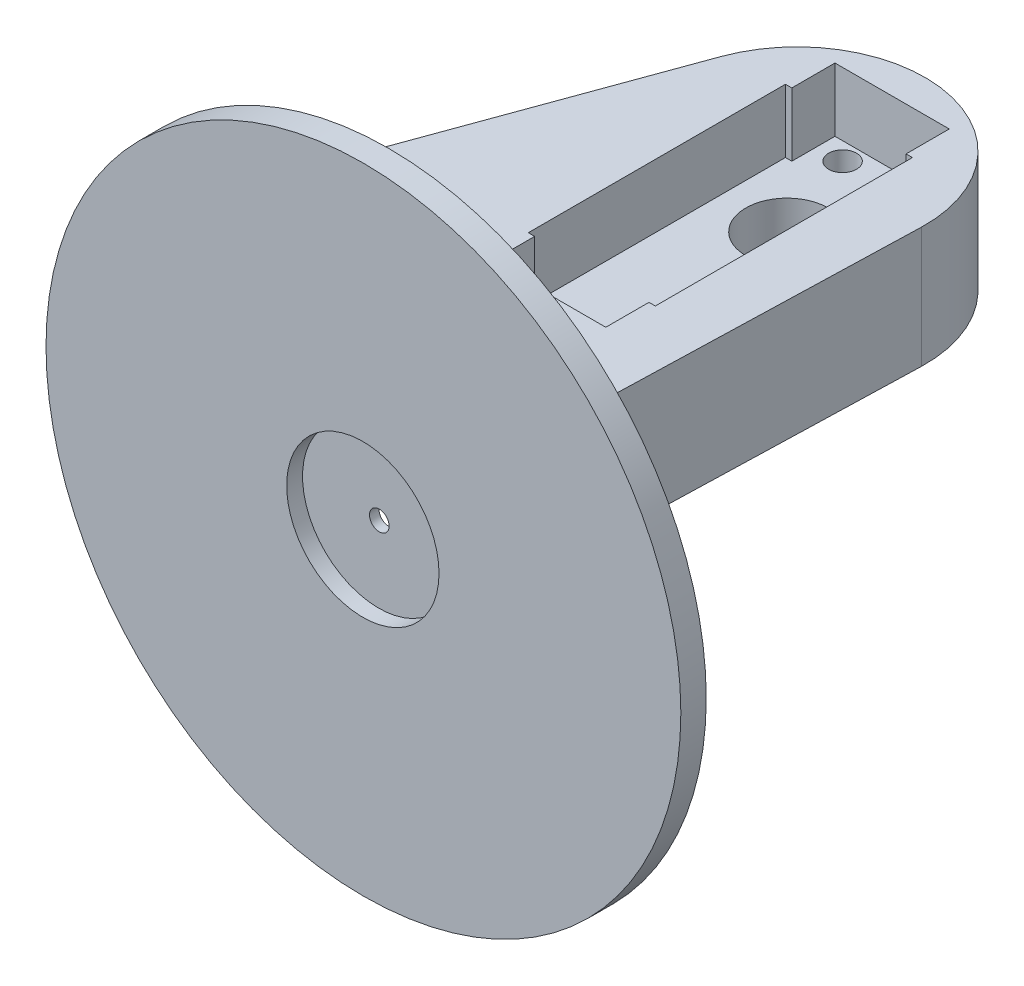
ISO-10303-21;
HEADER;
FILE_DESCRIPTION(('STEP AP214'),'2;1');
FILE_NAME('part.step','',(''),(''),'','','');
FILE_SCHEMA(('AUTOMOTIVE_DESIGN { 1 0 10303 214 1 1 1 1 }'));
ENDSEC;
DATA;
#1=APPLICATION_CONTEXT('core data for automotive mechanical design processes');
#2=APPLICATION_PROTOCOL_DEFINITION('international standard','automotive_design',2000,#1);
#3=PRODUCT_CONTEXT('',#1,'mechanical');
#4=PRODUCT('Part','Part','',(#3));
#5=PRODUCT_RELATED_PRODUCT_CATEGORY('part','',(#4));
#6=PRODUCT_DEFINITION_FORMATION('','',#4);
#7=PRODUCT_DEFINITION_CONTEXT('part definition',#1,'design');
#8=PRODUCT_DEFINITION('design','',#6,#7);
#9=PRODUCT_DEFINITION_SHAPE('','',#8);
#10=(LENGTH_UNIT() NAMED_UNIT(*) SI_UNIT(.MILLI.,.METRE.));
#11=(NAMED_UNIT(*) PLANE_ANGLE_UNIT() SI_UNIT($,.RADIAN.));
#12=(NAMED_UNIT(*) SI_UNIT($,.STERADIAN.) SOLID_ANGLE_UNIT());
#13=UNCERTAINTY_MEASURE_WITH_UNIT(LENGTH_MEASURE(1.E-05),#10,'distance_accuracy_value','');
#14=(GEOMETRIC_REPRESENTATION_CONTEXT(3) GLOBAL_UNCERTAINTY_ASSIGNED_CONTEXT((#13)) GLOBAL_UNIT_ASSIGNED_CONTEXT((#10,
#11,#12)) REPRESENTATION_CONTEXT('',''));
#15=CARTESIAN_POINT('',(0.,0.,0.));
#16=DIRECTION('',(0.,0.,1.));
#17=DIRECTION('',(1.,0.,0.));
#18=AXIS2_PLACEMENT_3D('',#15,#16,#17);
#19=CARTESIAN_POINT('',(-32.5425054731123,-36.3294906621392,35.2443237019626));
#20=DIRECTION('',(-0.717405595132056,0.,0.696655734257044));
#21=DIRECTION('',(0.,-1.,0.));
#22=AXIS2_PLACEMENT_3D('',#19,#20,#21);
#23=PLANE('',#22);
#24=DIRECTION('',(0.,-1.,0.));
#25=VECTOR('',#24,1.);
#26=CARTESIAN_POINT('',(-32.5425054731123,-36.3294906621392,35.2443237019626));
#27=LINE('',#26,#25);
#28=CARTESIAN_POINT('',(-32.5425054731123,-26.3294906621392,35.2443237019626));
#29=VERTEX_POINT('',#28);
#30=CARTESIAN_POINT('',(-32.5425054731123,-45.3294906621392,35.2443237019626));
#31=VERTEX_POINT('',#30);
#32=EDGE_CURVE('E398',#29,#31,#27,.T.);
#33=ORIENTED_EDGE('',*,*,#32,.F.);
#34=DIRECTION('',(-0.696655734257044,0.,-0.717405595132056));
#35=VECTOR('',#34,1.);
#36=CARTESIAN_POINT('',(-65.2809700757292,-26.3294906621392,1.53074534895049));
#37=LINE('',#36,#35);
#38=CARTESIAN_POINT('',(-25.0457346485598,-26.3294906621392,42.9643855208643));
#39=VERTEX_POINT('',#38);
#40=EDGE_CURVE('E161',#29,#39,#37,.F.);
#41=ORIENTED_EDGE('',*,*,#40,.T.);
#42=DIRECTION('',(0.,1.,0.));
#43=VECTOR('',#42,1.);
#44=CARTESIAN_POINT('',(-25.0457346485598,-53.1105605464471,42.9643855208643));
#45=LINE('',#44,#43);
#46=CARTESIAN_POINT('',(-25.0457346485598,-45.3294906621392,42.9643855208643));
#47=VERTEX_POINT('',#46);
#48=EDGE_CURVE('E401',#47,#39,#45,.T.);
#49=ORIENTED_EDGE('',*,*,#48,.F.);
#50=DIRECTION('',(0.696655734257044,0.,0.717405595132056));
#51=VECTOR('',#50,1.);
#52=CARTESIAN_POINT('',(-32.5425054731123,-45.3294906621392,35.2443237019626));
#53=LINE('',#52,#51);
#54=EDGE_CURVE('E13',#47,#31,#53,.F.);
#55=ORIENTED_EDGE('',*,*,#54,.T.);
#56=EDGE_LOOP('',(#33,#41,#49,#55));
#57=FACE_BOUND('',#56,.T.);
#58=ADVANCED_FACE('F153',(#57),#23,.F.);
#59=CARTESIAN_POINT('',(-41.3715056742024,-36.3294906621392,-20.2512811920762));
#60=DIRECTION('',(0.,0.,-1.));
#61=DIRECTION('',(-1.,0.,0.));
#62=AXIS2_PLACEMENT_3D('',#59,#60,#61);
#63=PLANE('',#62);
#64=DIRECTION('',(0.,1.,0.));
#65=VECTOR('',#64,1.);
#66=CARTESIAN_POINT('',(-42.3715056742024,-36.3294906621392,-20.2512811920762));
#67=LINE('',#66,#65);
#68=CARTESIAN_POINT('',(-42.3715056742024,-36.3294906621392,-20.2512811920762));
#69=VERTEX_POINT('',#68);
#70=CARTESIAN_POINT('',(-42.3715056742025,-26.3294906621392,-20.2512811920762));
#71=VERTEX_POINT('',#70);
#72=EDGE_CURVE('E282',#69,#71,#67,.T.);
#73=ORIENTED_EDGE('',*,*,#72,.F.);
#74=DIRECTION('',(-1.,0.,0.));
#75=VECTOR('',#74,1.);
#76=CARTESIAN_POINT('',(-41.3715056742024,-36.3294906621392,-20.2512811920762));
#77=LINE('',#76,#75);
#78=CARTESIAN_POINT('',(-41.3715056742024,-36.3294906621392,-20.2512811920762));
#79=VERTEX_POINT('',#78);
#80=EDGE_CURVE('E350',#79,#69,#77,.T.);
#81=ORIENTED_EDGE('',*,*,#80,.F.);
#82=DIRECTION('',(0.,1.,0.));
#83=VECTOR('',#82,1.);
#84=CARTESIAN_POINT('',(-41.3715056742024,-36.3294906621392,-20.2512811920762));
#85=LINE('',#84,#83);
#86=CARTESIAN_POINT('',(-41.3715056742024,-26.3294906621392,-20.2512811920762));
#87=VERTEX_POINT('',#86);
#88=EDGE_CURVE('E376',#79,#87,#85,.T.);
#89=ORIENTED_EDGE('',*,*,#88,.T.);
#90=DIRECTION('',(-1.,0.,0.));
#91=VECTOR('',#90,1.);
#92=CARTESIAN_POINT('',(-41.3715056742024,-26.3294906621392,-20.2512811920762));
#93=LINE('',#92,#91);
#94=EDGE_CURVE('E363',#87,#71,#93,.T.);
#95=ORIENTED_EDGE('',*,*,#94,.T.);
#96=EDGE_LOOP('',(#73,#81,#89,#95));
#97=FACE_BOUND('',#96,.T.);
#98=ADVANCED_FACE('F421',(#97),#63,.F.);
#99=CARTESIAN_POINT('',(-41.3715056742024,-36.3294906621392,20.2500000000002));
#100=DIRECTION('',(0.,0.,-1.));
#101=DIRECTION('',(-1.,0.,0.));
#102=AXIS2_PLACEMENT_3D('',#99,#100,#101);
#103=PLANE('',#102);
#104=DIRECTION('',(-1.,0.,0.));
#105=VECTOR('',#104,1.);
#106=CARTESIAN_POINT('',(-41.3715056742024,-26.3294906621392,20.2500000000002));
#107=LINE('',#106,#105);
#108=CARTESIAN_POINT('',(-60.3715056742024,-26.3294906621392,20.2500000000002));
#109=VERTEX_POINT('',#108);
#110=CARTESIAN_POINT('',(-61.3752997116946,-26.3294906621392,20.2500000000002));
#111=VERTEX_POINT('',#110);
#112=EDGE_CURVE('E369',#109,#111,#107,.T.);
#113=ORIENTED_EDGE('',*,*,#112,.F.);
#114=DIRECTION('',(0.,1.,0.));
#115=VECTOR('',#114,1.);
#116=CARTESIAN_POINT('',(-60.3715056742024,-36.3294906621392,20.2500000000002));
#117=LINE('',#116,#115);
#118=CARTESIAN_POINT('',(-60.3715056742024,-36.3294906621392,20.2500000000002));
#119=VERTEX_POINT('',#118);
#120=EDGE_CURVE('E334',#119,#109,#117,.T.);
#121=ORIENTED_EDGE('',*,*,#120,.F.);
#122=DIRECTION('',(-1.,0.,0.));
#123=VECTOR('',#122,1.);
#124=CARTESIAN_POINT('',(-41.3715056742024,-36.3294906621392,20.2500000000002));
#125=LINE('',#124,#123);
#126=CARTESIAN_POINT('',(-61.3752997116946,-36.3294906621392,20.2500000000002));
#127=VERTEX_POINT('',#126);
#128=EDGE_CURVE('E356',#119,#127,#125,.T.);
#129=ORIENTED_EDGE('',*,*,#128,.T.);
#130=DIRECTION('',(0.,1.,0.));
#131=VECTOR('',#130,1.);
#132=CARTESIAN_POINT('',(-61.3752997116946,-36.3294906621392,20.2500000000002));
#133=LINE('',#132,#131);
#134=EDGE_CURVE('E380',#127,#111,#133,.T.);
#135=ORIENTED_EDGE('',*,*,#134,.T.);
#136=EDGE_LOOP('',(#113,#121,#129,#135));
#137=FACE_BOUND('',#136,.T.);
#138=ADVANCED_FACE('F426',(#137),#103,.T.);
#139=CARTESIAN_POINT('',(-92.7691218237599,-36.3294906621392,42.9643855208643));
#140=DIRECTION('',(0.939692620785907,0.,0.342020143325673));
#141=DIRECTION('',(0.342020143325673,0.,-0.939692620785907));
#142=AXIS2_PLACEMENT_3D('',#139,#140,#141);
#143=PLANE('',#142);
#144=DIRECTION('',(0.342020143325673,0.,-0.939692620785907));
#145=VECTOR('',#144,1.);
#146=CARTESIAN_POINT('',(-92.7691218237599,-26.3294906621392,42.9643855208643));
#147=LINE('',#146,#145);
#148=CARTESIAN_POINT('',(-92.7691218237599,-26.3294906621392,42.9643855208643));
#149=VERTEX_POINT('',#148);
#150=CARTESIAN_POINT('',(-70.2427293849113,-26.3294906621392,-18.9263690466445));
#151=VERTEX_POINT('',#150);
#152=EDGE_CURVE('E279',#149,#151,#147,.T.);
#153=ORIENTED_EDGE('',*,*,#152,.T.);
#154=DIRECTION('',(0.,1.,0.));
#155=VECTOR('',#154,1.);
#156=CARTESIAN_POINT('',(-70.2427293849113,-36.3294906621392,-18.9263690466445));
#157=LINE('',#156,#155);
#158=CARTESIAN_POINT('',(-70.2427293849113,-45.3294906621392,-18.9263690466445));
#159=VERTEX_POINT('',#158);
#160=EDGE_CURVE('E274',#159,#151,#157,.T.);
#161=ORIENTED_EDGE('',*,*,#160,.F.);
#162=DIRECTION('',(0.342020143325673,0.,-0.939692620785907));
#163=VECTOR('',#162,1.);
#164=CARTESIAN_POINT('',(-92.7691218237599,-45.3294906621392,42.9643855208643));
#165=LINE('',#164,#163);
#166=CARTESIAN_POINT('',(-92.7691218237599,-45.3294906621392,42.9643855208643));
#167=VERTEX_POINT('',#166);
#168=EDGE_CURVE('E278',#167,#159,#165,.T.);
#169=ORIENTED_EDGE('',*,*,#168,.F.);
#170=DIRECTION('',(0.,1.,0.));
#171=VECTOR('',#170,1.);
#172=CARTESIAN_POINT('',(-92.7691218237599,-36.3294906621392,42.9643855208643));
#173=LINE('',#172,#171);
#174=EDGE_CURVE('E391',#167,#149,#173,.T.);
#175=ORIENTED_EDGE('',*,*,#174,.T.);
#176=EDGE_LOOP('',(#153,#161,#169,#175));
#177=FACE_BOUND('',#176,.T.);
#178=ADVANCED_FACE('F276',(#177),#143,.F.);
#179=CARTESIAN_POINT('',(-51.3105368076772,-36.3294906621392,-12.0356144791357));
#180=DIRECTION('',(0.,1.,0.));
#181=DIRECTION('',(-1.,0.,0.));
#182=AXIS2_PLACEMENT_3D('',#179,#180,#181);
#183=CYLINDRICAL_SURFACE('',#182,20.147218524926);
#184=CARTESIAN_POINT('',(-51.3105368076772,-26.3294906621392,-12.0356144791357));
#185=DIRECTION('',(0.,-1.,0.));
#186=DIRECTION('',(1.,0.,0.));
#187=AXIS2_PLACEMENT_3D('',#184,#185,#186);
#188=CIRCLE('',#187,20.147218524926);
#189=CARTESIAN_POINT('',(-31.1719928032039,-26.3294906621392,-11.4444633385483));
#190=VERTEX_POINT('',#189);
#191=EDGE_CURVE('E386',#151,#190,#188,.T.);
#192=ORIENTED_EDGE('',*,*,#191,.T.);
#193=DIRECTION('',(0.,1.,0.));
#194=VECTOR('',#193,1.);
#195=CARTESIAN_POINT('',(-31.1719928032039,-36.3294906621392,-11.4444633385483));
#196=LINE('',#195,#194);
#197=CARTESIAN_POINT('',(-31.1719928032039,-45.3294906621392,-11.4444633385483));
#198=VERTEX_POINT('',#197);
#199=EDGE_CURVE('E283',#198,#190,#196,.T.);
#200=ORIENTED_EDGE('',*,*,#199,.F.);
#201=CARTESIAN_POINT('',(-51.3105368076772,-45.3294906621392,-12.0356144791357));
#202=DIRECTION('',(0.,-1.,0.));
#203=DIRECTION('',(1.,0.,0.));
#204=AXIS2_PLACEMENT_3D('',#201,#202,#203);
#205=CIRCLE('',#204,20.147218524926);
#206=EDGE_CURVE('E286',#159,#198,#205,.T.);
#207=ORIENTED_EDGE('',*,*,#206,.F.);
#208=ORIENTED_EDGE('',*,*,#160,.T.);
#209=EDGE_LOOP('',(#192,#200,#207,#208));
#210=FACE_BOUND('',#209,.T.);
#211=ADVANCED_FACE('F287',(#210),#183,.T.);
#212=CARTESIAN_POINT('',(-32.7691218237599,-36.3294906621392,42.9643855208643));
#213=DIRECTION('',(0.999569443273668,0.,0.0293415758535591));
#214=DIRECTION('',(0.0293415758535591,0.,-0.999569443273668));
#215=AXIS2_PLACEMENT_3D('',#212,#213,#214);
#216=PLANE('',#215);
#217=DIRECTION('',(0.029341575853559,0.,-0.999569443273668));
#218=VECTOR('',#217,1.);
#219=CARTESIAN_POINT('',(-32.7691218237599,-26.3294906621392,42.9643855208643));
#220=LINE('',#219,#218);
#221=EDGE_CURVE('E388',#29,#190,#220,.T.);
#222=ORIENTED_EDGE('',*,*,#221,.F.);
#223=ORIENTED_EDGE('',*,*,#32,.T.);
#224=DIRECTION('',(-0.0293415758535594,0.,0.999569443273668));
#225=VECTOR('',#224,1.);
#226=CARTESIAN_POINT('',(-32.7691218237598,-45.3294906621392,42.9643855208643));
#227=LINE('',#226,#225);
#228=EDGE_CURVE('E292',#198,#31,#227,.T.);
#229=ORIENTED_EDGE('',*,*,#228,.F.);
#230=ORIENTED_EDGE('',*,*,#199,.T.);
#231=EDGE_LOOP('',(#222,#223,#229,#230));
#232=FACE_BOUND('',#231,.T.);
#233=ADVANCED_FACE('F409',(#232),#216,.T.);
#234=CARTESIAN_POINT('',(-51.3105368076772,-26.3294906621392,-12.0356144791357));
#235=DIRECTION('',(0.,-1.,0.));
#236=DIRECTION('',(1.,0.,0.));
#237=AXIS2_PLACEMENT_3D('',#234,#235,#236);
#238=PLANE('',#237);
#239=CARTESIAN_POINT('',(-60.3715056742024,-26.3294906621392,-20.2512811920762));
#240=VERTEX_POINT('',#239);
#241=CARTESIAN_POINT('',(-61.3752997116946,-26.3294906621392,-20.2512811920762));
#242=VERTEX_POINT('',#241);
#243=EDGE_CURVE('E349',#240,#242,#93,.T.);
#244=ORIENTED_EDGE('',*,*,#243,.F.);
#245=DIRECTION('',(0.,0.,1.));
#246=VECTOR('',#245,1.);
#247=CARTESIAN_POINT('',(-60.3715056742024,-26.3294906621392,-27.0499999999998));
#248=LINE('',#247,#246);
#249=CARTESIAN_POINT('',(-60.3715056742024,-26.3294906621392,-27.0499999999998));
#250=VERTEX_POINT('',#249);
#251=EDGE_CURVE('E310',#250,#240,#248,.T.);
#252=ORIENTED_EDGE('',*,*,#251,.F.);
#253=DIRECTION('',(1.,0.,0.));
#254=VECTOR('',#253,1.);
#255=CARTESIAN_POINT('',(-60.3715056742024,-26.3294906621392,-27.0499999999998));
#256=LINE('',#255,#254);
#257=CARTESIAN_POINT('',(-42.3715056742025,-26.3294906621392,-27.0499999999998));
#258=VERTEX_POINT('',#257);
#259=EDGE_CURVE('E318',#250,#258,#256,.T.);
#260=ORIENTED_EDGE('',*,*,#259,.T.);
#261=DIRECTION('',(0.,0.,1.));
#262=VECTOR('',#261,1.);
#263=CARTESIAN_POINT('',(-42.3715056742025,-26.3294906621392,-27.0499999999998));
#264=LINE('',#263,#262);
#265=EDGE_CURVE('E305',#258,#71,#264,.T.);
#266=ORIENTED_EDGE('',*,*,#265,.T.);
#267=ORIENTED_EDGE('',*,*,#94,.F.);
#268=DIRECTION('',(0.,0.,-1.));
#269=VECTOR('',#268,1.);
#270=CARTESIAN_POINT('',(-41.3715056742024,-26.3294906621392,20.2500000000002));
#271=LINE('',#270,#269);
#272=CARTESIAN_POINT('',(-41.3715056742024,-26.3294906621392,20.2500000000002));
#273=VERTEX_POINT('',#272);
#274=EDGE_CURVE('E373',#273,#87,#271,.T.);
#275=ORIENTED_EDGE('',*,*,#274,.F.);
#276=CARTESIAN_POINT('',(-42.3715056742025,-26.3294906621392,20.2500000000002));
#277=VERTEX_POINT('',#276);
#278=EDGE_CURVE('E370',#273,#277,#107,.T.);
#279=ORIENTED_EDGE('',*,*,#278,.T.);
#280=DIRECTION('',(0.,0.,-1.));
#281=VECTOR('',#280,1.);
#282=CARTESIAN_POINT('',(-42.3715056742025,-26.3294906621392,27.0500000000002));
#283=LINE('',#282,#281);
#284=CARTESIAN_POINT('',(-42.3715056742025,-26.3294906621392,27.0500000000002));
#285=VERTEX_POINT('',#284);
#286=EDGE_CURVE('E324',#285,#277,#283,.T.);
#287=ORIENTED_EDGE('',*,*,#286,.F.);
#288=DIRECTION('',(1.,0.,0.));
#289=VECTOR('',#288,1.);
#290=CARTESIAN_POINT('',(-60.3715056742024,-26.3294906621392,27.0500000000002));
#291=LINE('',#290,#289);
#292=CARTESIAN_POINT('',(-60.3715056742024,-26.3294906621392,27.0500000000002));
#293=VERTEX_POINT('',#292);
#294=EDGE_CURVE('E336',#293,#285,#291,.T.);
#295=ORIENTED_EDGE('',*,*,#294,.F.);
#296=DIRECTION('',(0.,0.,-1.));
#297=VECTOR('',#296,1.);
#298=CARTESIAN_POINT('',(-60.3715056742024,-26.3294906621392,27.0500000000002));
#299=LINE('',#298,#297);
#300=EDGE_CURVE('E329',#293,#109,#299,.T.);
#301=ORIENTED_EDGE('',*,*,#300,.T.);
#302=ORIENTED_EDGE('',*,*,#112,.T.);
#303=DIRECTION('',(0.,0.,-1.));
#304=VECTOR('',#303,1.);
#305=CARTESIAN_POINT('',(-61.3752997116946,-26.3294906621392,20.2500000000002));
#306=LINE('',#305,#304);
#307=EDGE_CURVE('E366',#111,#242,#306,.T.);
#308=ORIENTED_EDGE('',*,*,#307,.T.);
#309=EDGE_LOOP('',(#244,#252,#260,#266,#267,#275,#279,#287,#295,#301,#302,#308));
#310=FACE_BOUND('',#309,.T.);
#311=ORIENTED_EDGE('',*,*,#152,.F.);
#312=DIRECTION('',(-1.,0.,0.));
#313=VECTOR('',#312,1.);
#314=CARTESIAN_POINT('',(-32.7691218237599,-26.3294906621392,42.9643855208643));
#315=LINE('',#314,#313);
#316=EDGE_CURVE('E168',#39,#149,#315,.T.);
#317=ORIENTED_EDGE('',*,*,#316,.F.);
#318=ORIENTED_EDGE('',*,*,#40,.F.);
#319=ORIENTED_EDGE('',*,*,#221,.T.);
#320=ORIENTED_EDGE('',*,*,#191,.F.);
#321=EDGE_LOOP('',(#311,#317,#318,#319,#320));
#322=FACE_BOUND('',#321,.T.);
#323=ADVANCED_FACE('F407',(#310,#322),#238,.F.);
#324=CARTESIAN_POINT('',(-60.3715056742024,-36.3294906621392,-20.2512811920762));
#325=VERTEX_POINT('',#324);
#326=CARTESIAN_POINT('',(-61.3752997116946,-36.3294906621392,-20.2512811920762));
#327=VERTEX_POINT('',#326);
#328=EDGE_CURVE('E353',#325,#327,#77,.T.);
#329=ORIENTED_EDGE('',*,*,#328,.F.);
#330=DIRECTION('',(0.,1.,0.));
#331=VECTOR('',#330,1.);
#332=CARTESIAN_POINT('',(-60.3715056742024,-36.3294906621392,-20.2512811920762));
#333=LINE('',#332,#331);
#334=EDGE_CURVE('E395',#325,#240,#333,.T.);
#335=ORIENTED_EDGE('',*,*,#334,.T.);
#336=ORIENTED_EDGE('',*,*,#243,.T.);
#337=DIRECTION('',(0.,1.,0.));
#338=VECTOR('',#337,1.);
#339=CARTESIAN_POINT('',(-61.3752997116946,-36.3294906621392,-20.2512811920762));
#340=LINE('',#339,#338);
#341=EDGE_CURVE('E362',#327,#242,#340,.T.);
#342=ORIENTED_EDGE('',*,*,#341,.F.);
#343=EDGE_LOOP('',(#329,#335,#336,#342));
#344=FACE_BOUND('',#343,.T.);
#345=ADVANCED_FACE('F416',(#344),#63,.F.);
#346=CARTESIAN_POINT('',(-41.3715056742024,-36.3294906621392,20.2500000000002));
#347=DIRECTION('',(1.,0.,0.));
#348=DIRECTION('',(0.,1.,0.));
#349=AXIS2_PLACEMENT_3D('',#346,#347,#348);
#350=PLANE('',#349);
#351=ORIENTED_EDGE('',*,*,#274,.T.);
#352=ORIENTED_EDGE('',*,*,#88,.F.);
#353=DIRECTION('',(0.,0.,-1.));
#354=VECTOR('',#353,1.);
#355=CARTESIAN_POINT('',(-41.3715056742024,-36.3294906621392,20.2500000000002));
#356=LINE('',#355,#354);
#357=CARTESIAN_POINT('',(-41.3715056742024,-36.3294906621392,20.2500000000002));
#358=VERTEX_POINT('',#357);
#359=EDGE_CURVE('E360',#358,#79,#356,.T.);
#360=ORIENTED_EDGE('',*,*,#359,.F.);
#361=DIRECTION('',(0.,1.,0.));
#362=VECTOR('',#361,1.);
#363=CARTESIAN_POINT('',(-41.3715056742024,-36.3294906621392,20.2500000000002));
#364=LINE('',#363,#362);
#365=EDGE_CURVE('E378',#358,#273,#364,.T.);
#366=ORIENTED_EDGE('',*,*,#365,.T.);
#367=EDGE_LOOP('',(#351,#352,#360,#366));
#368=FACE_BOUND('',#367,.T.);
#369=ADVANCED_FACE('F438',(#368),#350,.F.);
#370=DIRECTION('',(0.,1.,0.));
#371=VECTOR('',#370,1.);
#372=CARTESIAN_POINT('',(-42.3715056742024,-36.3294906621392,20.2500000000002));
#373=LINE('',#372,#371);
#374=CARTESIAN_POINT('',(-42.3715056742024,-36.3294906621392,20.2500000000002));
#375=VERTEX_POINT('',#374);
#376=EDGE_CURVE('E346',#375,#277,#373,.T.);
#377=ORIENTED_EDGE('',*,*,#376,.T.);
#378=ORIENTED_EDGE('',*,*,#278,.F.);
#379=ORIENTED_EDGE('',*,*,#365,.F.);
#380=EDGE_CURVE('E357',#358,#375,#125,.T.);
#381=ORIENTED_EDGE('',*,*,#380,.T.);
#382=EDGE_LOOP('',(#377,#378,#379,#381));
#383=FACE_BOUND('',#382,.T.);
#384=ADVANCED_FACE('F434',(#383),#103,.T.);
#385=CARTESIAN_POINT('',(-61.3752997116946,-36.3294906621392,20.2500000000002));
#386=DIRECTION('',(1.,0.,0.));
#387=DIRECTION('',(0.,1.,0.));
#388=AXIS2_PLACEMENT_3D('',#385,#386,#387);
#389=PLANE('',#388);
#390=ORIENTED_EDGE('',*,*,#307,.F.);
#391=ORIENTED_EDGE('',*,*,#134,.F.);
#392=DIRECTION('',(0.,0.,-1.));
#393=VECTOR('',#392,1.);
#394=CARTESIAN_POINT('',(-61.3752997116946,-36.3294906621392,20.2500000000002));
#395=LINE('',#394,#393);
#396=EDGE_CURVE('E352',#127,#327,#395,.T.);
#397=ORIENTED_EDGE('',*,*,#396,.T.);
#398=ORIENTED_EDGE('',*,*,#341,.T.);
#399=EDGE_LOOP('',(#390,#391,#397,#398));
#400=FACE_BOUND('',#399,.T.);
#401=ADVANCED_FACE('F456',(#400),#389,.T.);
#402=CARTESIAN_POINT('',(-42.3715056742024,-36.3294906621392,27.0500000000002));
#403=DIRECTION('',(1.,0.,0.));
#404=DIRECTION('',(0.,1.,0.));
#405=AXIS2_PLACEMENT_3D('',#402,#403,#404);
#406=PLANE('',#405);
#407=ORIENTED_EDGE('',*,*,#286,.T.);
#408=ORIENTED_EDGE('',*,*,#376,.F.);
#409=DIRECTION('',(0.,0.,-1.));
#410=VECTOR('',#409,1.);
#411=CARTESIAN_POINT('',(-42.3715056742024,-36.3294906621392,27.0500000000002));
#412=LINE('',#411,#410);
#413=CARTESIAN_POINT('',(-42.3715056742024,-36.3294906621392,27.0500000000002));
#414=VERTEX_POINT('',#413);
#415=EDGE_CURVE('E326',#414,#375,#412,.T.);
#416=ORIENTED_EDGE('',*,*,#415,.F.);
#417=DIRECTION('',(0.,1.,0.));
#418=VECTOR('',#417,1.);
#419=CARTESIAN_POINT('',(-42.3715056742024,-36.3294906621392,27.0500000000002));
#420=LINE('',#419,#418);
#421=EDGE_CURVE('E344',#414,#285,#420,.T.);
#422=ORIENTED_EDGE('',*,*,#421,.T.);
#423=EDGE_LOOP('',(#407,#408,#416,#422));
#424=FACE_BOUND('',#423,.T.);
#425=ADVANCED_FACE('F472',(#424),#406,.F.);
#426=CARTESIAN_POINT('',(-60.3715056742024,-36.3294906621392,27.0500000000002));
#427=DIRECTION('',(0.,0.,1.));
#428=DIRECTION('',(1.,0.,0.));
#429=AXIS2_PLACEMENT_3D('',#426,#427,#428);
#430=PLANE('',#429);
#431=ORIENTED_EDGE('',*,*,#294,.T.);
#432=ORIENTED_EDGE('',*,*,#421,.F.);
#433=DIRECTION('',(1.,0.,0.));
#434=VECTOR('',#433,1.);
#435=CARTESIAN_POINT('',(-60.3715056742024,-36.3294906621392,27.0500000000002));
#436=LINE('',#435,#434);
#437=CARTESIAN_POINT('',(-60.3715056742024,-36.3294906621392,27.0500000000002));
#438=VERTEX_POINT('',#437);
#439=EDGE_CURVE('E328',#438,#414,#436,.T.);
#440=ORIENTED_EDGE('',*,*,#439,.F.);
#441=DIRECTION('',(0.,1.,0.));
#442=VECTOR('',#441,1.);
#443=CARTESIAN_POINT('',(-60.3715056742024,-36.3294906621392,27.0500000000002));
#444=LINE('',#443,#442);
#445=EDGE_CURVE('E342',#438,#293,#444,.T.);
#446=ORIENTED_EDGE('',*,*,#445,.T.);
#447=EDGE_LOOP('',(#431,#432,#440,#446));
#448=FACE_BOUND('',#447,.T.);
#449=ADVANCED_FACE('F467',(#448),#430,.F.);
#450=CARTESIAN_POINT('',(-60.3715056742024,-36.3294906621392,27.0500000000002));
#451=DIRECTION('',(1.,0.,0.));
#452=DIRECTION('',(0.,1.,0.));
#453=AXIS2_PLACEMENT_3D('',#450,#451,#452);
#454=PLANE('',#453);
#455=ORIENTED_EDGE('',*,*,#300,.F.);
#456=ORIENTED_EDGE('',*,*,#445,.F.);
#457=DIRECTION('',(0.,0.,-1.));
#458=VECTOR('',#457,1.);
#459=CARTESIAN_POINT('',(-60.3715056742024,-36.3294906621392,27.0500000000002));
#460=LINE('',#459,#458);
#461=EDGE_CURVE('E331',#438,#119,#460,.T.);
#462=ORIENTED_EDGE('',*,*,#461,.T.);
#463=ORIENTED_EDGE('',*,*,#120,.T.);
#464=EDGE_LOOP('',(#455,#456,#462,#463));
#465=FACE_BOUND('',#464,.T.);
#466=ADVANCED_FACE('F462',(#465),#454,.T.);
#467=CARTESIAN_POINT('',(-60.3715056742024,-36.3294906621392,-27.0499999999998));
#468=DIRECTION('',(-1.,0.,0.));
#469=DIRECTION('',(0.,-1.,0.));
#470=AXIS2_PLACEMENT_3D('',#467,#468,#469);
#471=PLANE('',#470);
#472=DIRECTION('',(0.,0.,1.));
#473=VECTOR('',#472,1.);
#474=CARTESIAN_POINT('',(-60.3715056742024,-36.3294906621392,-27.0499999999998));
#475=LINE('',#474,#473);
#476=CARTESIAN_POINT('',(-60.3715056742024,-36.3294906621392,-27.0499999999998));
#477=VERTEX_POINT('',#476);
#478=EDGE_CURVE('E313',#477,#325,#475,.T.);
#479=ORIENTED_EDGE('',*,*,#478,.F.);
#480=DIRECTION('',(0.,1.,0.));
#481=VECTOR('',#480,1.);
#482=CARTESIAN_POINT('',(-60.3715056742024,-36.3294906621392,-27.0499999999998));
#483=LINE('',#482,#481);
#484=EDGE_CURVE('E322',#477,#250,#483,.T.);
#485=ORIENTED_EDGE('',*,*,#484,.T.);
#486=ORIENTED_EDGE('',*,*,#251,.T.);
#487=ORIENTED_EDGE('',*,*,#334,.F.);
#488=EDGE_LOOP('',(#479,#485,#486,#487));
#489=FACE_BOUND('',#488,.T.);
#490=ADVANCED_FACE('F491',(#489),#471,.F.);
#491=CARTESIAN_POINT('',(-42.3715056742024,-36.3294906621392,-27.0499999999998));
#492=DIRECTION('',(-1.,0.,0.));
#493=DIRECTION('',(0.,-1.,0.));
#494=AXIS2_PLACEMENT_3D('',#491,#492,#493);
#495=PLANE('',#494);
#496=ORIENTED_EDGE('',*,*,#72,.T.);
#497=ORIENTED_EDGE('',*,*,#265,.F.);
#498=DIRECTION('',(0.,1.,0.));
#499=VECTOR('',#498,1.);
#500=CARTESIAN_POINT('',(-42.3715056742024,-36.3294906621392,-27.0499999999998));
#501=LINE('',#500,#499);
#502=CARTESIAN_POINT('',(-42.3715056742024,-36.3294906621392,-27.0499999999998));
#503=VERTEX_POINT('',#502);
#504=EDGE_CURVE('E315',#503,#258,#501,.T.);
#505=ORIENTED_EDGE('',*,*,#504,.F.);
#506=DIRECTION('',(0.,0.,1.));
#507=VECTOR('',#506,1.);
#508=CARTESIAN_POINT('',(-42.3715056742024,-36.3294906621392,-27.0499999999998));
#509=LINE('',#508,#507);
#510=EDGE_CURVE('E306',#503,#69,#509,.T.);
#511=ORIENTED_EDGE('',*,*,#510,.T.);
#512=EDGE_LOOP('',(#496,#497,#505,#511));
#513=FACE_BOUND('',#512,.T.);
#514=ADVANCED_FACE('F482',(#513),#495,.T.);
#515=CARTESIAN_POINT('',(-60.3715056742024,-36.3294906621392,-27.0499999999998));
#516=DIRECTION('',(0.,0.,1.));
#517=DIRECTION('',(1.,0.,0.));
#518=AXIS2_PLACEMENT_3D('',#515,#516,#517);
#519=PLANE('',#518);
#520=ORIENTED_EDGE('',*,*,#259,.F.);
#521=ORIENTED_EDGE('',*,*,#484,.F.);
#522=DIRECTION('',(1.,0.,0.));
#523=VECTOR('',#522,1.);
#524=CARTESIAN_POINT('',(-60.3715056742024,-36.3294906621392,-27.0499999999998));
#525=LINE('',#524,#523);
#526=EDGE_CURVE('E309',#477,#503,#525,.T.);
#527=ORIENTED_EDGE('',*,*,#526,.T.);
#528=ORIENTED_EDGE('',*,*,#504,.T.);
#529=EDGE_LOOP('',(#520,#521,#527,#528));
#530=FACE_BOUND('',#529,.T.);
#531=ADVANCED_FACE('F489',(#530),#519,.T.);
#532=CARTESIAN_POINT('',(-51.3105368076772,-36.3294906621392,-12.0356144791357));
#533=DIRECTION('',(0.,-1.,0.));
#534=DIRECTION('',(1.,0.,0.));
#535=AXIS2_PLACEMENT_3D('',#532,#533,#534);
#536=PLANE('',#535);
#537=CARTESIAN_POINT('',(-51.1215056742024,-36.3294906621392,-10.2499999999998));
#538=DIRECTION('',(0.,-1.,0.));
#539=DIRECTION('',(1.,0.,0.));
#540=AXIS2_PLACEMENT_3D('',#537,#538,#539);
#541=CIRCLE('',#540,6.49999999999999);
#542=CARTESIAN_POINT('',(-44.6215056742025,-36.3294906621392,-10.2499999999998));
#543=VERTEX_POINT('',#542);
#544=EDGE_CURVE('E728',#543,#543,#541,.T.);
#545=ORIENTED_EDGE('',*,*,#544,.T.);
#546=EDGE_LOOP('',(#545));
#547=FACE_BOUND('',#546,.T.);
#548=CARTESIAN_POINT('',(-46.3715056742024,-36.3294906621392,-24.2499999999998));
#549=DIRECTION('',(0.,-1.,0.));
#550=DIRECTION('',(1.,0.,0.));
#551=AXIS2_PLACEMENT_3D('',#548,#549,#550);
#552=CIRCLE('',#551,2.20000000000002);
#553=CARTESIAN_POINT('',(-44.1715056742024,-36.3294906621392,-24.2499999999998));
#554=VERTEX_POINT('',#553);
#555=EDGE_CURVE('E731',#554,#554,#552,.T.);
#556=ORIENTED_EDGE('',*,*,#555,.T.);
#557=EDGE_LOOP('',(#556));
#558=FACE_BOUND('',#557,.T.);
#559=CARTESIAN_POINT('',(-56.3715056742024,-36.3294906621392,-24.2499999999998));
#560=DIRECTION('',(0.,-1.,0.));
#561=DIRECTION('',(1.,0.,0.));
#562=AXIS2_PLACEMENT_3D('',#559,#560,#561);
#563=CIRCLE('',#562,2.20000000000002);
#564=CARTESIAN_POINT('',(-54.1715056742024,-36.3294906621392,-24.2499999999998));
#565=VERTEX_POINT('',#564);
#566=EDGE_CURVE('E737',#565,#565,#563,.T.);
#567=ORIENTED_EDGE('',*,*,#566,.T.);
#568=EDGE_LOOP('',(#567));
#569=FACE_BOUND('',#568,.T.);
#570=CARTESIAN_POINT('',(-46.3715056742024,-36.3294906621392,24.2500000000002));
#571=DIRECTION('',(0.,-1.,0.));
#572=DIRECTION('',(1.,0.,0.));
#573=AXIS2_PLACEMENT_3D('',#570,#571,#572);
#574=CIRCLE('',#573,2.20000000000002);
#575=CARTESIAN_POINT('',(-44.1715056742024,-36.3294906621392,24.2500000000002));
#576=VERTEX_POINT('',#575);
#577=EDGE_CURVE('E743',#576,#576,#574,.T.);
#578=ORIENTED_EDGE('',*,*,#577,.T.);
#579=EDGE_LOOP('',(#578));
#580=FACE_BOUND('',#579,.T.);
#581=CARTESIAN_POINT('',(-56.3715056742024,-36.3294906621392,24.2500000000002));
#582=DIRECTION('',(0.,-1.,0.));
#583=DIRECTION('',(1.,0.,0.));
#584=AXIS2_PLACEMENT_3D('',#581,#582,#583);
#585=CIRCLE('',#584,2.20000000000003);
#586=CARTESIAN_POINT('',(-54.1715056742024,-36.3294906621392,24.2500000000002));
#587=VERTEX_POINT('',#586);
#588=EDGE_CURVE('E299',#587,#587,#585,.T.);
#589=ORIENTED_EDGE('',*,*,#588,.T.);
#590=EDGE_LOOP('',(#589));
#591=FACE_BOUND('',#590,.T.);
#592=ORIENTED_EDGE('',*,*,#526,.F.);
#593=ORIENTED_EDGE('',*,*,#478,.T.);
#594=ORIENTED_EDGE('',*,*,#328,.T.);
#595=ORIENTED_EDGE('',*,*,#396,.F.);
#596=ORIENTED_EDGE('',*,*,#128,.F.);
#597=ORIENTED_EDGE('',*,*,#461,.F.);
#598=ORIENTED_EDGE('',*,*,#439,.T.);
#599=ORIENTED_EDGE('',*,*,#415,.T.);
#600=ORIENTED_EDGE('',*,*,#380,.F.);
#601=ORIENTED_EDGE('',*,*,#359,.T.);
#602=ORIENTED_EDGE('',*,*,#80,.T.);
#603=ORIENTED_EDGE('',*,*,#510,.F.);
#604=EDGE_LOOP('',(#592,#593,#594,#595,#596,#597,#598,#599,#600,#601,#602,#603));
#605=FACE_BOUND('',#604,.T.);
#606=ADVANCED_FACE('F450',(#547,#558,#569,#580,#591,#605),#536,.F.);
#607=CARTESIAN_POINT('',(-51.3105368076772,-45.3294906621392,-12.0356144791357));
#608=DIRECTION('',(0.,-1.,0.));
#609=DIRECTION('',(1.,0.,0.));
#610=AXIS2_PLACEMENT_3D('',#607,#608,#609);
#611=PLANE('',#610);
#612=CARTESIAN_POINT('',(-51.1215056742024,-45.3294906621392,-10.2499999999998));
#613=DIRECTION('',(0.,-1.,0.));
#614=DIRECTION('',(1.,0.,0.));
#615=AXIS2_PLACEMENT_3D('',#612,#613,#614);
#616=CIRCLE('',#615,6.49999999999999);
#617=CARTESIAN_POINT('',(-44.6215056742024,-45.3294906621392,-10.2499999999998));
#618=VERTEX_POINT('',#617);
#619=EDGE_CURVE('E725',#618,#618,#616,.T.);
#620=ORIENTED_EDGE('',*,*,#619,.F.);
#621=EDGE_LOOP('',(#620));
#622=FACE_BOUND('',#621,.T.);
#623=CARTESIAN_POINT('',(-56.3715056742024,-45.3294906621392,-24.2499999999998));
#624=DIRECTION('',(0.,-1.,0.));
#625=DIRECTION('',(1.,0.,0.));
#626=AXIS2_PLACEMENT_3D('',#623,#624,#625);
#627=CIRCLE('',#626,2.20000000000002);
#628=CARTESIAN_POINT('',(-54.1715056742024,-45.3294906621392,-24.2499999999998));
#629=VERTEX_POINT('',#628);
#630=EDGE_CURVE('E740',#629,#629,#627,.T.);
#631=ORIENTED_EDGE('',*,*,#630,.F.);
#632=EDGE_LOOP('',(#631));
#633=FACE_BOUND('',#632,.T.);
#634=CARTESIAN_POINT('',(-56.3715056742024,-45.3294906621392,24.2500000000002));
#635=DIRECTION('',(0.,-1.,0.));
#636=DIRECTION('',(1.,0.,0.));
#637=AXIS2_PLACEMENT_3D('',#634,#635,#636);
#638=CIRCLE('',#637,2.20000000000003);
#639=CARTESIAN_POINT('',(-54.1715056742024,-45.3294906621392,24.2500000000002));
#640=VERTEX_POINT('',#639);
#641=EDGE_CURVE('E296',#640,#640,#638,.T.);
#642=ORIENTED_EDGE('',*,*,#641,.F.);
#643=EDGE_LOOP('',(#642));
#644=FACE_BOUND('',#643,.T.);
#645=ORIENTED_EDGE('',*,*,#168,.T.);
#646=ORIENTED_EDGE('',*,*,#206,.T.);
#647=ORIENTED_EDGE('',*,*,#228,.T.);
#648=ORIENTED_EDGE('',*,*,#54,.F.);
#649=DIRECTION('',(-1.,0.,0.));
#650=VECTOR('',#649,1.);
#651=CARTESIAN_POINT('',(-92.7691218237599,-45.3294906621392,42.9643855208643));
#652=LINE('',#651,#650);
#653=EDGE_CURVE('E176',#47,#167,#652,.T.);
#654=ORIENTED_EDGE('',*,*,#653,.T.);
#655=EDGE_LOOP('',(#645,#646,#647,#648,#654));
#656=FACE_BOUND('',#655,.T.);
#657=CARTESIAN_POINT('',(-46.3715056742024,-45.3294906621392,24.2500000000002));
#658=DIRECTION('',(0.,-1.,0.));
#659=DIRECTION('',(1.,0.,0.));
#660=AXIS2_PLACEMENT_3D('',#657,#658,#659);
#661=CIRCLE('',#660,2.20000000000002);
#662=CARTESIAN_POINT('',(-44.1715056742024,-45.3294906621392,24.2500000000002));
#663=VERTEX_POINT('',#662);
#664=EDGE_CURVE('E746',#663,#663,#661,.T.);
#665=ORIENTED_EDGE('',*,*,#664,.F.);
#666=EDGE_LOOP('',(#665));
#667=FACE_BOUND('',#666,.T.);
#668=CARTESIAN_POINT('',(-46.3715056742024,-45.3294906621392,-24.2499999999998));
#669=DIRECTION('',(0.,-1.,0.));
#670=DIRECTION('',(1.,0.,0.));
#671=AXIS2_PLACEMENT_3D('',#668,#669,#670);
#672=CIRCLE('',#671,2.20000000000002);
#673=CARTESIAN_POINT('',(-44.1715056742024,-45.3294906621392,-24.2499999999998));
#674=VERTEX_POINT('',#673);
#675=EDGE_CURVE('E734',#674,#674,#672,.T.);
#676=ORIENTED_EDGE('',*,*,#675,.F.);
#677=EDGE_LOOP('',(#676));
#678=FACE_BOUND('',#677,.T.);
#679=ADVANCED_FACE('F294',(#622,#633,#644,#656,#667,#678),#611,.T.);
#680=CARTESIAN_POINT('',(-56.3715056742024,-45.3294906621392,24.2500000000002));
#681=DIRECTION('',(0.,1.,0.));
#682=DIRECTION('',(-1.,0.,0.));
#683=AXIS2_PLACEMENT_3D('',#680,#681,#682);
#684=CYLINDRICAL_SURFACE('',#683,2.20000000000003);
#685=ORIENTED_EDGE('',*,*,#641,.T.);
#686=EDGE_LOOP('',(#685));
#687=FACE_BOUND('',#686,.T.);
#688=ORIENTED_EDGE('',*,*,#588,.F.);
#689=EDGE_LOOP('',(#688));
#690=FACE_BOUND('',#689,.T.);
#691=ADVANCED_FACE('F592',(#687,#690),#684,.F.);
#692=CARTESIAN_POINT('',(-46.3715056742024,-45.3294906621392,24.2500000000002));
#693=DIRECTION('',(0.,1.,0.));
#694=DIRECTION('',(-1.,0.,0.));
#695=AXIS2_PLACEMENT_3D('',#692,#693,#694);
#696=CYLINDRICAL_SURFACE('',#695,2.20000000000002);
#697=ORIENTED_EDGE('',*,*,#664,.T.);
#698=EDGE_LOOP('',(#697));
#699=FACE_BOUND('',#698,.T.);
#700=ORIENTED_EDGE('',*,*,#577,.F.);
#701=EDGE_LOOP('',(#700));
#702=FACE_BOUND('',#701,.T.);
#703=ADVANCED_FACE('F601',(#699,#702),#696,.F.);
#704=CARTESIAN_POINT('',(-56.3715056742024,-45.3294906621392,-24.2499999999998));
#705=DIRECTION('',(0.,1.,0.));
#706=DIRECTION('',(-1.,0.,0.));
#707=AXIS2_PLACEMENT_3D('',#704,#705,#706);
#708=CYLINDRICAL_SURFACE('',#707,2.20000000000002);
#709=ORIENTED_EDGE('',*,*,#630,.T.);
#710=EDGE_LOOP('',(#709));
#711=FACE_BOUND('',#710,.T.);
#712=ORIENTED_EDGE('',*,*,#566,.F.);
#713=EDGE_LOOP('',(#712));
#714=FACE_BOUND('',#713,.T.);
#715=ADVANCED_FACE('F611',(#711,#714),#708,.F.);
#716=CARTESIAN_POINT('',(-46.3715056742024,-45.3294906621392,-24.2499999999998));
#717=DIRECTION('',(0.,1.,0.));
#718=DIRECTION('',(-1.,0.,0.));
#719=AXIS2_PLACEMENT_3D('',#716,#717,#718);
#720=CYLINDRICAL_SURFACE('',#719,2.20000000000002);
#721=ORIENTED_EDGE('',*,*,#675,.T.);
#722=EDGE_LOOP('',(#721));
#723=FACE_BOUND('',#722,.T.);
#724=ORIENTED_EDGE('',*,*,#555,.F.);
#725=EDGE_LOOP('',(#724));
#726=FACE_BOUND('',#725,.T.);
#727=ADVANCED_FACE('F621',(#723,#726),#720,.F.);
#728=CARTESIAN_POINT('',(-51.1215056742024,-36.3294906621392,-10.2499999999998));
#729=DIRECTION('',(0.,-1.,0.));
#730=DIRECTION('',(1.,0.,0.));
#731=AXIS2_PLACEMENT_3D('',#728,#729,#730);
#732=CYLINDRICAL_SURFACE('',#731,6.49999999999999);
#733=ORIENTED_EDGE('',*,*,#544,.F.);
#734=EDGE_LOOP('',(#733));
#735=FACE_BOUND('',#734,.T.);
#736=ORIENTED_EDGE('',*,*,#619,.T.);
#737=EDGE_LOOP('',(#736));
#738=FACE_BOUND('',#737,.T.);
#739=ADVANCED_FACE('F630',(#735,#738),#732,.F.);
#740=CARTESIAN_POINT('',(-60.6338713767585,-53.1105605464471,42.9643855208643));
#741=DIRECTION('',(0.,0.,1.));
#742=DIRECTION('',(1.,0.,0.));
#743=AXIS2_PLACEMENT_3D('',#740,#741,#742);
#744=PLANE('',#743);
#745=CARTESIAN_POINT('',(-60.6338713767585,-53.1105605464471,42.9643855208643));
#746=DIRECTION('',(0.,0.,1.));
#747=DIRECTION('',(1.,0.,0.));
#748=AXIS2_PLACEMENT_3D('',#745,#746,#747);
#749=CIRCLE('',#748,1.55);
#750=CARTESIAN_POINT('',(-59.0838713767585,-53.1105605464471,42.9643855208643));
#751=VERTEX_POINT('',#750);
#752=EDGE_CURVE('E716',#751,#751,#749,.T.);
#753=ORIENTED_EDGE('',*,*,#752,.T.);
#754=EDGE_LOOP('',(#753));
#755=FACE_BOUND('',#754,.T.);
#756=CARTESIAN_POINT('',(-60.6338713767585,-53.1105605464471,42.9643855208643));
#757=DIRECTION('',(0.,0.,1.));
#758=DIRECTION('',(1.,0.,0.));
#759=AXIS2_PLACEMENT_3D('',#756,#757,#758);
#760=CIRCLE('',#759,50.);
#761=CARTESIAN_POINT('',(-10.6338713767584,-53.1105605464471,42.9643855208643));
#762=VERTEX_POINT('',#761);
#763=EDGE_CURVE('E719',#762,#762,#760,.T.);
#764=ORIENTED_EDGE('',*,*,#763,.F.);
#765=EDGE_LOOP('',(#764));
#766=FACE_BOUND('',#765,.T.);
#767=ORIENTED_EDGE('',*,*,#48,.T.);
#768=ORIENTED_EDGE('',*,*,#316,.T.);
#769=ORIENTED_EDGE('',*,*,#174,.F.);
#770=ORIENTED_EDGE('',*,*,#653,.F.);
#771=EDGE_LOOP('',(#767,#768,#769,#770));
#772=FACE_BOUND('',#771,.T.);
#773=ADVANCED_FACE('F406',(#755,#766,#772),#744,.F.);
#774=CARTESIAN_POINT('',(-60.6338713767585,-53.1105605464471,46.9643855208643));
#775=DIRECTION('',(0.,0.,-1.));
#776=DIRECTION('',(-1.,0.,0.));
#777=AXIS2_PLACEMENT_3D('',#774,#775,#776);
#778=CYLINDRICAL_SURFACE('',#777,50.);
#779=CARTESIAN_POINT('',(-60.6338713767585,-53.1105605464471,46.9643855208643));
#780=DIRECTION('',(0.,0.,1.));
#781=DIRECTION('',(1.,0.,0.));
#782=AXIS2_PLACEMENT_3D('',#779,#780,#781);
#783=CIRCLE('',#782,50.);
#784=CARTESIAN_POINT('',(-10.6338713767584,-53.1105605464471,46.9643855208643));
#785=VERTEX_POINT('',#784);
#786=EDGE_CURVE('E722',#785,#785,#783,.T.);
#787=ORIENTED_EDGE('',*,*,#786,.F.);
#788=EDGE_LOOP('',(#787));
#789=FACE_BOUND('',#788,.T.);
#790=ORIENTED_EDGE('',*,*,#763,.T.);
#791=EDGE_LOOP('',(#790));
#792=FACE_BOUND('',#791,.T.);
#793=ADVANCED_FACE('F647',(#789,#792),#778,.T.);
#794=CARTESIAN_POINT('',(-60.6338713767585,-53.1105605464471,46.9643855208643));
#795=DIRECTION('',(0.,0.,1.));
#796=DIRECTION('',(1.,0.,0.));
#797=AXIS2_PLACEMENT_3D('',#794,#795,#796);
#798=PLANE('',#797);
#799=CARTESIAN_POINT('',(-60.7251325290733,-53.1203757959143,46.9643855208643));
#800=DIRECTION('',(0.,0.,1.));
#801=DIRECTION('',(1.,0.,0.));
#802=AXIS2_PLACEMENT_3D('',#799,#800,#801);
#803=CIRCLE('',#802,12.);
#804=CARTESIAN_POINT('',(-48.7251325290733,-53.1203757959143,46.9643855208643));
#805=VERTEX_POINT('',#804);
#806=EDGE_CURVE('E711',#805,#805,#803,.T.);
#807=ORIENTED_EDGE('',*,*,#806,.F.);
#808=EDGE_LOOP('',(#807));
#809=FACE_BOUND('',#808,.T.);
#810=ORIENTED_EDGE('',*,*,#786,.T.);
#811=EDGE_LOOP('',(#810));
#812=FACE_BOUND('',#811,.T.);
#813=ADVANCED_FACE('F657',(#809,#812),#798,.T.);
#814=CARTESIAN_POINT('',(-60.6338713767585,-53.1105605464471,44.4643855208643));
#815=DIRECTION('',(0.,0.,1.));
#816=DIRECTION('',(1.,0.,0.));
#817=AXIS2_PLACEMENT_3D('',#814,#815,#816);
#818=PLANE('',#817);
#819=CARTESIAN_POINT('',(-60.6338713767585,-53.1105605464471,44.4643855208643));
#820=DIRECTION('',(0.,0.,1.));
#821=DIRECTION('',(1.,0.,0.));
#822=AXIS2_PLACEMENT_3D('',#819,#820,#821);
#823=CIRCLE('',#822,1.55);
#824=CARTESIAN_POINT('',(-59.0838713767585,-53.1105605464471,44.4643855208643));
#825=VERTEX_POINT('',#824);
#826=EDGE_CURVE('E713',#825,#825,#823,.T.);
#827=ORIENTED_EDGE('',*,*,#826,.F.);
#828=EDGE_LOOP('',(#827));
#829=FACE_BOUND('',#828,.T.);
#830=CARTESIAN_POINT('',(-60.7251325290733,-53.1203757959143,44.4643855208643));
#831=DIRECTION('',(0.,0.,1.));
#832=DIRECTION('',(1.,0.,0.));
#833=AXIS2_PLACEMENT_3D('',#830,#831,#832);
#834=CIRCLE('',#833,12.);
#835=CARTESIAN_POINT('',(-48.7251325290733,-53.1203757959143,44.4643855208643));
#836=VERTEX_POINT('',#835);
#837=EDGE_CURVE('E708',#836,#836,#834,.T.);
#838=ORIENTED_EDGE('',*,*,#837,.T.);
#839=EDGE_LOOP('',(#838));
#840=FACE_BOUND('',#839,.T.);
#841=ADVANCED_FACE('F666',(#829,#840),#818,.T.);
#842=CARTESIAN_POINT('',(-60.6338713767585,-53.1105605464471,42.9643855208643));
#843=DIRECTION('',(0.,0.,1.));
#844=DIRECTION('',(1.,0.,0.));
#845=AXIS2_PLACEMENT_3D('',#842,#843,#844);
#846=CYLINDRICAL_SURFACE('',#845,1.55);
#847=ORIENTED_EDGE('',*,*,#752,.F.);
#848=EDGE_LOOP('',(#847));
#849=FACE_BOUND('',#848,.T.);
#850=ORIENTED_EDGE('',*,*,#826,.T.);
#851=EDGE_LOOP('',(#850));
#852=FACE_BOUND('',#851,.T.);
#853=ADVANCED_FACE('F677',(#849,#852),#846,.F.);
#854=CARTESIAN_POINT('',(-60.7251325290733,-53.1203757959143,44.4643855208643));
#855=DIRECTION('',(0.,0.,1.));
#856=DIRECTION('',(1.,0.,0.));
#857=AXIS2_PLACEMENT_3D('',#854,#855,#856);
#858=CYLINDRICAL_SURFACE('',#857,12.);
#859=ORIENTED_EDGE('',*,*,#837,.F.);
#860=EDGE_LOOP('',(#859));
#861=FACE_BOUND('',#860,.T.);
#862=ORIENTED_EDGE('',*,*,#806,.T.);
#863=EDGE_LOOP('',(#862));
#864=FACE_BOUND('',#863,.T.);
#865=ADVANCED_FACE('F687',(#861,#864),#858,.F.);
#866=CLOSED_SHELL('',(#58,#98,#138,#178,#211,#233,#323,#345,#369,#384,#401,#425,#449,#466,#490,
#514,#531,#606,#679,#691,#703,#715,#727,#739,#773,#793,#813,#841,#853,#865));
#867=MANIFOLD_SOLID_BREP('B2',#866);
#868=ADVANCED_BREP_SHAPE_REPRESENTATION('',(#18,#867),#14);
#869=SHAPE_DEFINITION_REPRESENTATION(#9,#868);
ENDSEC;
END-ISO-10303-21;
